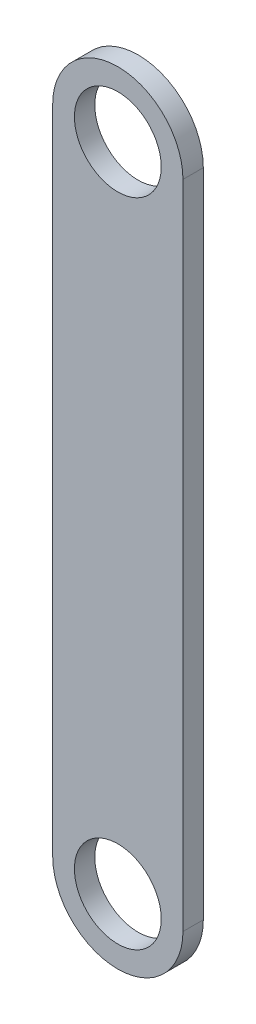
ISO-10303-21;
HEADER;
FILE_DESCRIPTION(('STEP AP214'),'2;1');
FILE_NAME('part.step','',(''),(''),'','','');
FILE_SCHEMA(('AUTOMOTIVE_DESIGN { 1 0 10303 214 1 1 1 1 }'));
ENDSEC;
DATA;
#1=APPLICATION_CONTEXT('core data for automotive mechanical design processes');
#2=APPLICATION_PROTOCOL_DEFINITION('international standard','automotive_design',2000,#1);
#3=PRODUCT_CONTEXT('',#1,'mechanical');
#4=PRODUCT('Part','Part','',(#3));
#5=PRODUCT_RELATED_PRODUCT_CATEGORY('part','',(#4));
#6=PRODUCT_DEFINITION_FORMATION('','',#4);
#7=PRODUCT_DEFINITION_CONTEXT('part definition',#1,'design');
#8=PRODUCT_DEFINITION('design','',#6,#7);
#9=PRODUCT_DEFINITION_SHAPE('','',#8);
#10=(LENGTH_UNIT() NAMED_UNIT(*) SI_UNIT(.MILLI.,.METRE.));
#11=(NAMED_UNIT(*) PLANE_ANGLE_UNIT() SI_UNIT($,.RADIAN.));
#12=(NAMED_UNIT(*) SI_UNIT($,.STERADIAN.) SOLID_ANGLE_UNIT());
#13=UNCERTAINTY_MEASURE_WITH_UNIT(LENGTH_MEASURE(1.E-05),#10,'distance_accuracy_value','');
#14=(GEOMETRIC_REPRESENTATION_CONTEXT(3) GLOBAL_UNCERTAINTY_ASSIGNED_CONTEXT((#13)) GLOBAL_UNIT_ASSIGNED_CONTEXT((#10,
#11,#12)) REPRESENTATION_CONTEXT('',''));
#15=CARTESIAN_POINT('',(0.,0.,0.));
#16=DIRECTION('',(0.,0.,1.));
#17=DIRECTION('',(1.,0.,0.));
#18=AXIS2_PLACEMENT_3D('',#15,#16,#17);
#19=CARTESIAN_POINT('',(0.,15.875,3.47265625));
#20=DIRECTION('',(0.,0.,1.));
#21=DIRECTION('',(1.,0.,0.));
#22=AXIS2_PLACEMENT_3D('',#19,#20,#21);
#23=PLANE('',#22);
#24=CARTESIAN_POINT('',(0.,15.875,3.47265625));
#25=DIRECTION('',(0.,0.,1.));
#26=DIRECTION('',(1.,0.,0.));
#27=AXIS2_PLACEMENT_3D('',#24,#25,#26);
#28=CIRCLE('',#27,6.35);
#29=CARTESIAN_POINT('',(6.35,15.875,3.47265625));
#30=VERTEX_POINT('',#29);
#31=EDGE_CURVE('E106',#30,#30,#28,.T.);
#32=ORIENTED_EDGE('',*,*,#31,.F.);
#33=EDGE_LOOP('',(#32));
#34=FACE_BOUND('',#33,.T.);
#35=CARTESIAN_POINT('',(0.,15.875,3.47265625));
#36=DIRECTION('',(0.,0.,1.));
#37=DIRECTION('',(1.,0.,0.));
#38=AXIS2_PLACEMENT_3D('',#35,#36,#37);
#39=CIRCLE('',#38,9.525);
#40=CARTESIAN_POINT('',(-9.525,15.875,3.47265625));
#41=VERTEX_POINT('',#40);
#42=CARTESIAN_POINT('',(9.525,15.875,3.47265625));
#43=VERTEX_POINT('',#42);
#44=EDGE_CURVE('E91',#41,#43,#39,.T.);
#45=ORIENTED_EDGE('',*,*,#44,.T.);
#46=DIRECTION('',(0.,1.,0.));
#47=VECTOR('',#46,1.);
#48=CARTESIAN_POINT('',(9.525,15.875,3.47265625));
#49=LINE('',#48,#47);
#50=CARTESIAN_POINT('',(9.525,111.125,3.47265625));
#51=VERTEX_POINT('',#50);
#52=EDGE_CURVE('E86',#43,#51,#49,.T.);
#53=ORIENTED_EDGE('',*,*,#52,.T.);
#54=CARTESIAN_POINT('',(0.,111.125,3.47265625));
#55=DIRECTION('',(0.,0.,1.));
#56=DIRECTION('',(1.,0.,0.));
#57=AXIS2_PLACEMENT_3D('',#54,#55,#56);
#58=CIRCLE('',#57,9.525);
#59=CARTESIAN_POINT('',(-9.525,111.125,3.47265625));
#60=VERTEX_POINT('',#59);
#61=EDGE_CURVE('E89',#51,#60,#58,.T.);
#62=ORIENTED_EDGE('',*,*,#61,.T.);
#63=DIRECTION('',(0.,-1.,0.));
#64=VECTOR('',#63,1.);
#65=CARTESIAN_POINT('',(-9.525,15.875,3.47265625));
#66=LINE('',#65,#64);
#67=EDGE_CURVE('E56',#60,#41,#66,.T.);
#68=ORIENTED_EDGE('',*,*,#67,.T.);
#69=EDGE_LOOP('',(#45,#53,#62,#68));
#70=FACE_BOUND('',#69,.T.);
#71=CARTESIAN_POINT('',(0.,111.125,3.47265625));
#72=DIRECTION('',(0.,0.,1.));
#73=DIRECTION('',(1.,0.,0.));
#74=AXIS2_PLACEMENT_3D('',#71,#72,#73);
#75=CIRCLE('',#74,6.35);
#76=CARTESIAN_POINT('',(6.35,111.125,3.47265625));
#77=VERTEX_POINT('',#76);
#78=EDGE_CURVE('E121',#77,#77,#75,.T.);
#79=ORIENTED_EDGE('',*,*,#78,.F.);
#80=EDGE_LOOP('',(#79));
#81=FACE_BOUND('',#80,.T.);
#82=ADVANCED_FACE('F39',(#34,#70,#81),#23,.T.);
#83=CARTESIAN_POINT('',(0.,15.875,0.49609375));
#84=DIRECTION('',(0.,0.,1.));
#85=DIRECTION('',(1.,0.,0.));
#86=AXIS2_PLACEMENT_3D('',#83,#84,#85);
#87=PLANE('',#86);
#88=CARTESIAN_POINT('',(0.,15.875,0.49609375));
#89=DIRECTION('',(0.,0.,1.));
#90=DIRECTION('',(1.,0.,0.));
#91=AXIS2_PLACEMENT_3D('',#88,#89,#90);
#92=CIRCLE('',#91,9.525);
#93=CARTESIAN_POINT('',(-9.525,15.875,0.49609375));
#94=VERTEX_POINT('',#93);
#95=CARTESIAN_POINT('',(9.525,15.875,0.49609375));
#96=VERTEX_POINT('',#95);
#97=EDGE_CURVE('E103',#94,#96,#92,.T.);
#98=ORIENTED_EDGE('',*,*,#97,.F.);
#99=DIRECTION('',(0.,-1.,0.));
#100=VECTOR('',#99,1.);
#101=CARTESIAN_POINT('',(-9.525,15.875,0.49609375));
#102=LINE('',#101,#100);
#103=CARTESIAN_POINT('',(-9.525,111.125,0.49609375));
#104=VERTEX_POINT('',#103);
#105=EDGE_CURVE('E79',#104,#94,#102,.T.);
#106=ORIENTED_EDGE('',*,*,#105,.F.);
#107=CARTESIAN_POINT('',(0.,111.125,0.49609375));
#108=DIRECTION('',(0.,0.,1.));
#109=DIRECTION('',(1.,0.,0.));
#110=AXIS2_PLACEMENT_3D('',#107,#108,#109);
#111=CIRCLE('',#110,9.525);
#112=CARTESIAN_POINT('',(9.525,111.125,0.49609375));
#113=VERTEX_POINT('',#112);
#114=EDGE_CURVE('E73',#113,#104,#111,.T.);
#115=ORIENTED_EDGE('',*,*,#114,.F.);
#116=DIRECTION('',(0.,1.,0.));
#117=VECTOR('',#116,1.);
#118=CARTESIAN_POINT('',(9.525,15.875,0.49609375));
#119=LINE('',#118,#117);
#120=EDGE_CURVE('E95',#96,#113,#119,.T.);
#121=ORIENTED_EDGE('',*,*,#120,.F.);
#122=EDGE_LOOP('',(#98,#106,#115,#121));
#123=FACE_BOUND('',#122,.T.);
#124=CARTESIAN_POINT('',(0.,15.875,0.49609375));
#125=DIRECTION('',(0.,0.,1.));
#126=DIRECTION('',(1.,0.,0.));
#127=AXIS2_PLACEMENT_3D('',#124,#125,#126);
#128=CIRCLE('',#127,6.35);
#129=CARTESIAN_POINT('',(6.35,15.875,0.49609375));
#130=VERTEX_POINT('',#129);
#131=EDGE_CURVE('E118',#130,#130,#128,.T.);
#132=ORIENTED_EDGE('',*,*,#131,.T.);
#133=EDGE_LOOP('',(#132));
#134=FACE_BOUND('',#133,.T.);
#135=CARTESIAN_POINT('',(0.,111.125,0.49609375));
#136=DIRECTION('',(0.,0.,1.));
#137=DIRECTION('',(1.,0.,0.));
#138=AXIS2_PLACEMENT_3D('',#135,#136,#137);
#139=CIRCLE('',#138,6.35);
#140=CARTESIAN_POINT('',(6.35,111.125,0.49609375));
#141=VERTEX_POINT('',#140);
#142=EDGE_CURVE('E124',#141,#141,#139,.T.);
#143=ORIENTED_EDGE('',*,*,#142,.T.);
#144=EDGE_LOOP('',(#143));
#145=FACE_BOUND('',#144,.T.);
#146=ADVANCED_FACE('F114',(#123,#134,#145),#87,.F.);
#147=CARTESIAN_POINT('',(0.,15.875,3.47265625));
#148=DIRECTION('',(0.,0.,-1.));
#149=DIRECTION('',(-1.,0.,0.));
#150=AXIS2_PLACEMENT_3D('',#147,#148,#149);
#151=CYLINDRICAL_SURFACE('',#150,9.525);
#152=ORIENTED_EDGE('',*,*,#97,.T.);
#153=DIRECTION('',(0.,0.,-1.));
#154=VECTOR('',#153,1.);
#155=CARTESIAN_POINT('',(9.525,15.875,3.47265625));
#156=LINE('',#155,#154);
#157=EDGE_CURVE('E11',#43,#96,#156,.T.);
#158=ORIENTED_EDGE('',*,*,#157,.F.);
#159=ORIENTED_EDGE('',*,*,#44,.F.);
#160=DIRECTION('',(0.,0.,-1.));
#161=VECTOR('',#160,1.);
#162=CARTESIAN_POINT('',(-9.525,15.875,3.47265625));
#163=LINE('',#162,#161);
#164=EDGE_CURVE('E99',#41,#94,#163,.T.);
#165=ORIENTED_EDGE('',*,*,#164,.T.);
#166=EDGE_LOOP('',(#152,#158,#159,#165));
#167=FACE_BOUND('',#166,.T.);
#168=ADVANCED_FACE('F41',(#167),#151,.T.);
#169=CARTESIAN_POINT('',(9.525,15.875,3.47265625));
#170=DIRECTION('',(-1.,0.,0.));
#171=DIRECTION('',(0.,0.,1.));
#172=AXIS2_PLACEMENT_3D('',#169,#170,#171);
#173=PLANE('',#172);
#174=ORIENTED_EDGE('',*,*,#120,.T.);
#175=DIRECTION('',(0.,0.,-1.));
#176=VECTOR('',#175,1.);
#177=CARTESIAN_POINT('',(9.525,111.125,3.47265625));
#178=LINE('',#177,#176);
#179=EDGE_CURVE('E48',#51,#113,#178,.T.);
#180=ORIENTED_EDGE('',*,*,#179,.F.);
#181=ORIENTED_EDGE('',*,*,#52,.F.);
#182=ORIENTED_EDGE('',*,*,#157,.T.);
#183=EDGE_LOOP('',(#174,#180,#181,#182));
#184=FACE_BOUND('',#183,.T.);
#185=ADVANCED_FACE('F94',(#184),#173,.F.);
#186=CARTESIAN_POINT('',(0.,111.125,3.47265625));
#187=DIRECTION('',(0.,0.,-1.));
#188=DIRECTION('',(-1.,0.,0.));
#189=AXIS2_PLACEMENT_3D('',#186,#187,#188);
#190=CYLINDRICAL_SURFACE('',#189,9.525);
#191=ORIENTED_EDGE('',*,*,#114,.T.);
#192=DIRECTION('',(0.,0.,-1.));
#193=VECTOR('',#192,1.);
#194=CARTESIAN_POINT('',(-9.525,111.125,3.47265625));
#195=LINE('',#194,#193);
#196=EDGE_CURVE('E96',#60,#104,#195,.T.);
#197=ORIENTED_EDGE('',*,*,#196,.F.);
#198=ORIENTED_EDGE('',*,*,#61,.F.);
#199=ORIENTED_EDGE('',*,*,#179,.T.);
#200=EDGE_LOOP('',(#191,#197,#198,#199));
#201=FACE_BOUND('',#200,.T.);
#202=ADVANCED_FACE('F97',(#201),#190,.T.);
#203=CARTESIAN_POINT('',(-9.525,15.875,3.47265625));
#204=DIRECTION('',(1.,0.,0.));
#205=DIRECTION('',(0.,0.,-1.));
#206=AXIS2_PLACEMENT_3D('',#203,#204,#205);
#207=PLANE('',#206);
#208=ORIENTED_EDGE('',*,*,#105,.T.);
#209=ORIENTED_EDGE('',*,*,#164,.F.);
#210=ORIENTED_EDGE('',*,*,#67,.F.);
#211=ORIENTED_EDGE('',*,*,#196,.T.);
#212=EDGE_LOOP('',(#208,#209,#210,#211));
#213=FACE_BOUND('',#212,.T.);
#214=ADVANCED_FACE('F111',(#213),#207,.F.);
#215=CARTESIAN_POINT('',(0.,15.875,3.47265625));
#216=DIRECTION('',(0.,0.,-1.));
#217=DIRECTION('',(-1.,0.,0.));
#218=AXIS2_PLACEMENT_3D('',#215,#216,#217);
#219=CYLINDRICAL_SURFACE('',#218,6.35);
#220=ORIENTED_EDGE('',*,*,#31,.T.);
#221=EDGE_LOOP('',(#220));
#222=FACE_BOUND('',#221,.T.);
#223=ORIENTED_EDGE('',*,*,#131,.F.);
#224=EDGE_LOOP('',(#223));
#225=FACE_BOUND('',#224,.T.);
#226=ADVANCED_FACE('F141',(#222,#225),#219,.F.);
#227=CARTESIAN_POINT('',(0.,111.125,3.47265625));
#228=DIRECTION('',(0.,0.,-1.));
#229=DIRECTION('',(-1.,0.,0.));
#230=AXIS2_PLACEMENT_3D('',#227,#228,#229);
#231=CYLINDRICAL_SURFACE('',#230,6.35);
#232=ORIENTED_EDGE('',*,*,#78,.T.);
#233=EDGE_LOOP('',(#232));
#234=FACE_BOUND('',#233,.T.);
#235=ORIENTED_EDGE('',*,*,#142,.F.);
#236=EDGE_LOOP('',(#235));
#237=FACE_BOUND('',#236,.T.);
#238=ADVANCED_FACE('F130',(#234,#237),#231,.F.);
#239=CLOSED_SHELL('',(#82,#146,#168,#185,#202,#214,#226,#238));
#240=MANIFOLD_SOLID_BREP('B2',#239);
#241=ADVANCED_BREP_SHAPE_REPRESENTATION('',(#18,#240),#14);
#242=SHAPE_DEFINITION_REPRESENTATION(#9,#241);
ENDSEC;
END-ISO-10303-21;
